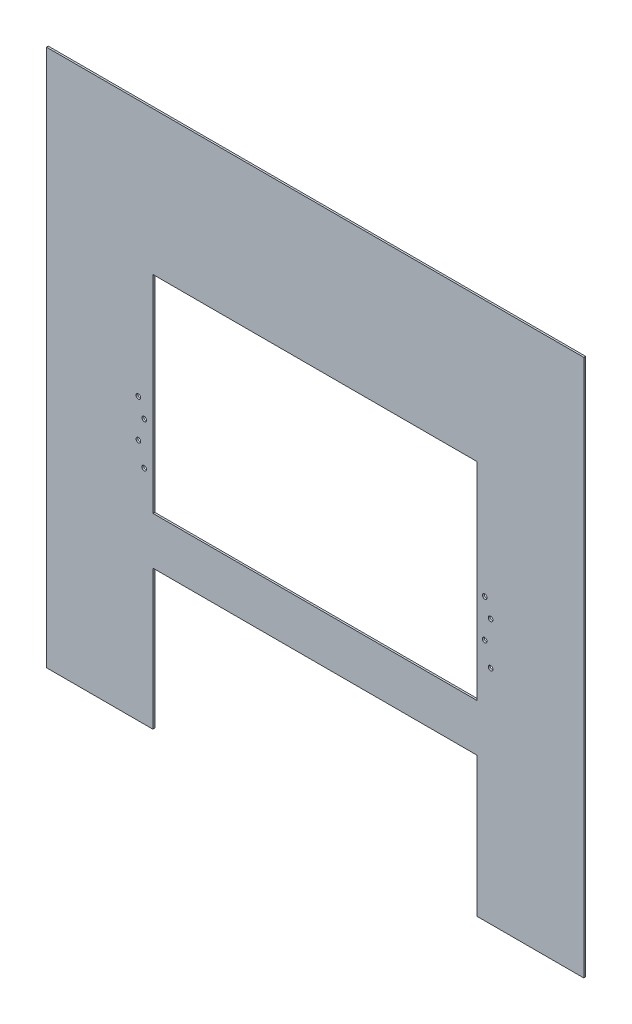
ISO-10303-21;
HEADER;
FILE_DESCRIPTION(('STEP AP214'),'2;1');
FILE_NAME('part.step','',(''),(''),'','','');
FILE_SCHEMA(('AUTOMOTIVE_DESIGN { 1 0 10303 214 1 1 1 1 }'));
ENDSEC;
DATA;
#1=APPLICATION_CONTEXT('core data for automotive mechanical design processes');
#2=APPLICATION_PROTOCOL_DEFINITION('international standard','automotive_design',2000,#1);
#3=PRODUCT_CONTEXT('',#1,'mechanical');
#4=PRODUCT('Part','Part','',(#3));
#5=PRODUCT_RELATED_PRODUCT_CATEGORY('part','',(#4));
#6=PRODUCT_DEFINITION_FORMATION('','',#4);
#7=PRODUCT_DEFINITION_CONTEXT('part definition',#1,'design');
#8=PRODUCT_DEFINITION('design','',#6,#7);
#9=PRODUCT_DEFINITION_SHAPE('','',#8);
#10=(LENGTH_UNIT() NAMED_UNIT(*) SI_UNIT(.MILLI.,.METRE.));
#11=(NAMED_UNIT(*) PLANE_ANGLE_UNIT() SI_UNIT($,.RADIAN.));
#12=(NAMED_UNIT(*) SI_UNIT($,.STERADIAN.) SOLID_ANGLE_UNIT());
#13=UNCERTAINTY_MEASURE_WITH_UNIT(LENGTH_MEASURE(1.E-05),#10,'distance_accuracy_value','');
#14=(GEOMETRIC_REPRESENTATION_CONTEXT(3) GLOBAL_UNCERTAINTY_ASSIGNED_CONTEXT((#13)) GLOBAL_UNIT_ASSIGNED_CONTEXT((#10,
#11,#12)) REPRESENTATION_CONTEXT('',''));
#15=CARTESIAN_POINT('',(0.,0.,0.));
#16=DIRECTION('',(0.,0.,1.));
#17=DIRECTION('',(1.,0.,0.));
#18=AXIS2_PLACEMENT_3D('',#15,#16,#17);
#19=CARTESIAN_POINT('',(0.,0.,2.));
#20=DIRECTION('',(0.,0.,-1.));
#21=DIRECTION('',(-1.,0.,0.));
#22=AXIS2_PLACEMENT_3D('',#19,#20,#21);
#23=PLANE('',#22);
#24=DIRECTION('',(0.,1.,0.));
#25=VECTOR('',#24,1.);
#26=CARTESIAN_POINT('',(650.,580.,2.));
#27=LINE('',#26,#25);
#28=CARTESIAN_POINT('',(650.,0.,2.));
#29=VERTEX_POINT('',#28);
#30=CARTESIAN_POINT('',(650.,580.,2.));
#31=VERTEX_POINT('',#30);
#32=EDGE_CURVE('E165',#29,#31,#27,.T.);
#33=ORIENTED_EDGE('',*,*,#32,.T.);
#34=DIRECTION('',(-1.,0.,0.));
#35=VECTOR('',#34,1.);
#36=CARTESIAN_POINT('',(69.9999999999999,580.,2.));
#37=LINE('',#36,#35);
#38=CARTESIAN_POINT('',(69.9999999999999,580.,2.));
#39=VERTEX_POINT('',#38);
#40=EDGE_CURVE('E168',#31,#39,#37,.T.);
#41=ORIENTED_EDGE('',*,*,#40,.T.);
#42=DIRECTION('',(0.,-1.,0.));
#43=VECTOR('',#42,1.);
#44=CARTESIAN_POINT('',(69.9999999999999,580.,2.));
#45=LINE('',#44,#43);
#46=CARTESIAN_POINT('',(69.9999999999999,0.,2.));
#47=VERTEX_POINT('',#46);
#48=EDGE_CURVE('E171',#39,#47,#45,.T.);
#49=ORIENTED_EDGE('',*,*,#48,.T.);
#50=DIRECTION('',(1.,0.,0.));
#51=VECTOR('',#50,1.);
#52=CARTESIAN_POINT('',(69.9999999999999,0.,2.));
#53=LINE('',#52,#51);
#54=CARTESIAN_POINT('',(185.,0.,2.));
#55=VERTEX_POINT('',#54);
#56=EDGE_CURVE('E173',#47,#55,#53,.T.);
#57=ORIENTED_EDGE('',*,*,#56,.T.);
#58=DIRECTION('',(0.,1.,0.));
#59=VECTOR('',#58,1.);
#60=CARTESIAN_POINT('',(185.,150.575,2.));
#61=LINE('',#60,#59);
#62=CARTESIAN_POINT('',(185.,150.575,2.));
#63=VERTEX_POINT('',#62);
#64=EDGE_CURVE('E175',#55,#63,#61,.T.);
#65=ORIENTED_EDGE('',*,*,#64,.T.);
#66=DIRECTION('',(1.,0.,0.));
#67=VECTOR('',#66,1.);
#68=CARTESIAN_POINT('',(185.,150.575,2.));
#69=LINE('',#68,#67);
#70=CARTESIAN_POINT('',(535.,150.575,2.));
#71=VERTEX_POINT('',#70);
#72=EDGE_CURVE('E177',#63,#71,#69,.T.);
#73=ORIENTED_EDGE('',*,*,#72,.T.);
#74=DIRECTION('',(0.,-1.,0.));
#75=VECTOR('',#74,1.);
#76=CARTESIAN_POINT('',(535.,150.575,2.));
#77=LINE('',#76,#75);
#78=CARTESIAN_POINT('',(535.,0.,2.));
#79=VERTEX_POINT('',#78);
#80=EDGE_CURVE('E179',#71,#79,#77,.T.);
#81=ORIENTED_EDGE('',*,*,#80,.T.);
#82=DIRECTION('',(1.,0.,0.));
#83=VECTOR('',#82,1.);
#84=CARTESIAN_POINT('',(650.,0.,2.));
#85=LINE('',#84,#83);
#86=EDGE_CURVE('E181',#79,#29,#85,.T.);
#87=ORIENTED_EDGE('',*,*,#86,.T.);
#88=EDGE_LOOP('',(#33,#41,#49,#57,#65,#73,#81,#87));
#89=FACE_BOUND('',#88,.T.);
#90=DIRECTION('',(0.,-1.,0.));
#91=VECTOR('',#90,1.);
#92=CARTESIAN_POINT('',(185.,425.,2.));
#93=LINE('',#92,#91);
#94=CARTESIAN_POINT('',(185.,425.,2.));
#95=VERTEX_POINT('',#94);
#96=CARTESIAN_POINT('',(185.,201.725,2.));
#97=VERTEX_POINT('',#96);
#98=EDGE_CURVE('E126',#95,#97,#93,.T.);
#99=ORIENTED_EDGE('',*,*,#98,.F.);
#100=DIRECTION('',(-1.,0.,0.));
#101=VECTOR('',#100,1.);
#102=CARTESIAN_POINT('',(185.,425.,2.));
#103=LINE('',#102,#101);
#104=CARTESIAN_POINT('',(535.,425.,2.));
#105=VERTEX_POINT('',#104);
#106=EDGE_CURVE('E149',#105,#95,#103,.T.);
#107=ORIENTED_EDGE('',*,*,#106,.F.);
#108=DIRECTION('',(0.,1.,0.));
#109=VECTOR('',#108,1.);
#110=CARTESIAN_POINT('',(535.,425.,2.));
#111=LINE('',#110,#109);
#112=CARTESIAN_POINT('',(535.,201.725,2.));
#113=VERTEX_POINT('',#112);
#114=EDGE_CURVE('E147',#113,#105,#111,.T.);
#115=ORIENTED_EDGE('',*,*,#114,.F.);
#116=DIRECTION('',(1.,0.,0.));
#117=VECTOR('',#116,1.);
#118=CARTESIAN_POINT('',(185.,201.725,2.));
#119=LINE('',#118,#117);
#120=EDGE_CURVE('E134',#97,#113,#119,.T.);
#121=ORIENTED_EDGE('',*,*,#120,.F.);
#122=EDGE_LOOP('',(#99,#107,#115,#121));
#123=FACE_BOUND('',#122,.T.);
#124=CARTESIAN_POINT('',(169.299999999994,303.1,2.));
#125=DIRECTION('',(0.,0.,1.));
#126=DIRECTION('',(1.,0.,0.));
#127=AXIS2_PLACEMENT_3D('',#124,#125,#126);
#128=CIRCLE('',#127,2.50000000000579);
#129=CARTESIAN_POINT('',(171.8,303.1,2.));
#130=VERTEX_POINT('',#129);
#131=EDGE_CURVE('E155',#130,#130,#128,.T.);
#132=ORIENTED_EDGE('',*,*,#131,.F.);
#133=EDGE_LOOP('',(#132));
#134=FACE_BOUND('',#133,.T.);
#135=CARTESIAN_POINT('',(175.620271067171,285.300000000006,2.));
#136=DIRECTION('',(0.,0.,1.));
#137=DIRECTION('',(1.,0.,0.));
#138=AXIS2_PLACEMENT_3D('',#135,#136,#137);
#139=CIRCLE('',#138,2.50000000000649);
#140=CARTESIAN_POINT('',(178.120271067178,285.300000000006,2.));
#141=VERTEX_POINT('',#140);
#142=EDGE_CURVE('E367',#141,#141,#139,.T.);
#143=ORIENTED_EDGE('',*,*,#142,.F.);
#144=EDGE_LOOP('',(#143));
#145=FACE_BOUND('',#144,.T.);
#146=CARTESIAN_POINT('',(175.620271067171,239.279728932807,2.));
#147=DIRECTION('',(0.,0.,1.));
#148=DIRECTION('',(1.,0.,0.));
#149=AXIS2_PLACEMENT_3D('',#146,#147,#148);
#150=CIRCLE('',#149,2.50000000000649);
#151=CARTESIAN_POINT('',(178.120271067178,239.279728932807,2.));
#152=VERTEX_POINT('',#151);
#153=EDGE_CURVE('E361',#152,#152,#150,.T.);
#154=ORIENTED_EDGE('',*,*,#153,.F.);
#155=EDGE_LOOP('',(#154));
#156=FACE_BOUND('',#155,.T.);
#157=CARTESIAN_POINT('',(169.3,262.3,2.));
#158=DIRECTION('',(0.,0.,1.));
#159=DIRECTION('',(1.,0.,0.));
#160=AXIS2_PLACEMENT_3D('',#157,#158,#159);
#161=CIRCLE('',#160,2.5);
#162=CARTESIAN_POINT('',(171.8,262.3,2.));
#163=VERTEX_POINT('',#162);
#164=EDGE_CURVE('E355',#163,#163,#161,.T.);
#165=ORIENTED_EDGE('',*,*,#164,.F.);
#166=EDGE_LOOP('',(#165));
#167=FACE_BOUND('',#166,.T.);
#168=CARTESIAN_POINT('',(543.099999999994,303.100000000007,2.));
#169=DIRECTION('',(0.,0.,1.));
#170=DIRECTION('',(1.,0.,0.));
#171=AXIS2_PLACEMENT_3D('',#168,#169,#170);
#172=CIRCLE('',#171,2.50000000000571);
#173=CARTESIAN_POINT('',(545.6,303.100000000007,2.));
#174=VERTEX_POINT('',#173);
#175=EDGE_CURVE('E349',#174,#174,#172,.T.);
#176=ORIENTED_EDGE('',*,*,#175,.F.);
#177=EDGE_LOOP('',(#176));
#178=FACE_BOUND('',#177,.T.);
#179=CARTESIAN_POINT('',(549.420271067171,285.300000000012,2.));
#180=DIRECTION('',(0.,0.,1.));
#181=DIRECTION('',(1.,0.,0.));
#182=AXIS2_PLACEMENT_3D('',#179,#180,#181);
#183=CIRCLE('',#182,2.50000000000652);
#184=CARTESIAN_POINT('',(551.920271067178,285.300000000012,2.));
#185=VERTEX_POINT('',#184);
#186=EDGE_CURVE('E343',#185,#185,#183,.T.);
#187=ORIENTED_EDGE('',*,*,#186,.F.);
#188=EDGE_LOOP('',(#187));
#189=FACE_BOUND('',#188,.T.);
#190=CARTESIAN_POINT('',(549.420271067171,239.279728932813,2.));
#191=DIRECTION('',(0.,0.,1.));
#192=DIRECTION('',(1.,0.,0.));
#193=AXIS2_PLACEMENT_3D('',#190,#191,#192);
#194=CIRCLE('',#193,2.50000000000651);
#195=CARTESIAN_POINT('',(551.920271067178,239.279728932813,2.));
#196=VERTEX_POINT('',#195);
#197=EDGE_CURVE('E337',#196,#196,#194,.T.);
#198=ORIENTED_EDGE('',*,*,#197,.F.);
#199=EDGE_LOOP('',(#198));
#200=FACE_BOUND('',#199,.T.);
#201=CARTESIAN_POINT('',(543.1,262.300000000007,2.));
#202=DIRECTION('',(0.,0.,1.));
#203=DIRECTION('',(1.,0.,0.));
#204=AXIS2_PLACEMENT_3D('',#201,#202,#203);
#205=CIRCLE('',#204,2.50000000000002);
#206=CARTESIAN_POINT('',(545.6,262.300000000007,2.));
#207=VERTEX_POINT('',#206);
#208=EDGE_CURVE('E328',#207,#207,#205,.T.);
#209=ORIENTED_EDGE('',*,*,#208,.F.);
#210=EDGE_LOOP('',(#209));
#211=FACE_BOUND('',#210,.T.);
#212=ADVANCED_FACE('F37',(#89,#123,#134,#145,#156,#167,#178,#189,#200,#211),#23,.F.);
#213=CARTESIAN_POINT('',(0.,0.,0.));
#214=DIRECTION('',(0.,0.,-1.));
#215=DIRECTION('',(-1.,0.,0.));
#216=AXIS2_PLACEMENT_3D('',#213,#214,#215);
#217=PLANE('',#216);
#218=CARTESIAN_POINT('',(549.420271067171,239.279728932813,0.));
#219=DIRECTION('',(0.,0.,1.));
#220=DIRECTION('',(1.,0.,0.));
#221=AXIS2_PLACEMENT_3D('',#218,#219,#220);
#222=CIRCLE('',#221,2.50000000000651);
#223=CARTESIAN_POINT('',(551.920271067178,239.279728932813,0.));
#224=VERTEX_POINT('',#223);
#225=EDGE_CURVE('E334',#224,#224,#222,.T.);
#226=ORIENTED_EDGE('',*,*,#225,.T.);
#227=EDGE_LOOP('',(#226));
#228=FACE_BOUND('',#227,.T.);
#229=CARTESIAN_POINT('',(543.099999999994,303.100000000007,0.));
#230=DIRECTION('',(0.,0.,1.));
#231=DIRECTION('',(1.,0.,0.));
#232=AXIS2_PLACEMENT_3D('',#229,#230,#231);
#233=CIRCLE('',#232,2.50000000000571);
#234=CARTESIAN_POINT('',(545.6,303.100000000007,0.));
#235=VERTEX_POINT('',#234);
#236=EDGE_CURVE('E346',#235,#235,#233,.T.);
#237=ORIENTED_EDGE('',*,*,#236,.T.);
#238=EDGE_LOOP('',(#237));
#239=FACE_BOUND('',#238,.T.);
#240=CARTESIAN_POINT('',(175.620271067171,239.279728932807,0.));
#241=DIRECTION('',(0.,0.,1.));
#242=DIRECTION('',(1.,0.,0.));
#243=AXIS2_PLACEMENT_3D('',#240,#241,#242);
#244=CIRCLE('',#243,2.50000000000649);
#245=CARTESIAN_POINT('',(178.120271067178,239.279728932807,0.));
#246=VERTEX_POINT('',#245);
#247=EDGE_CURVE('E358',#246,#246,#244,.T.);
#248=ORIENTED_EDGE('',*,*,#247,.T.);
#249=EDGE_LOOP('',(#248));
#250=FACE_BOUND('',#249,.T.);
#251=CARTESIAN_POINT('',(169.299999999994,303.1,0.));
#252=DIRECTION('',(0.,0.,1.));
#253=DIRECTION('',(1.,0.,0.));
#254=AXIS2_PLACEMENT_3D('',#251,#252,#253);
#255=CIRCLE('',#254,2.50000000000579);
#256=CARTESIAN_POINT('',(171.8,303.1,0.));
#257=VERTEX_POINT('',#256);
#258=EDGE_CURVE('E370',#257,#257,#255,.T.);
#259=ORIENTED_EDGE('',*,*,#258,.T.);
#260=EDGE_LOOP('',(#259));
#261=FACE_BOUND('',#260,.T.);
#262=DIRECTION('',(0.,1.,0.));
#263=VECTOR('',#262,1.);
#264=CARTESIAN_POINT('',(650.,580.,0.));
#265=LINE('',#264,#263);
#266=CARTESIAN_POINT('',(650.,0.,0.));
#267=VERTEX_POINT('',#266);
#268=CARTESIAN_POINT('',(650.,580.,0.));
#269=VERTEX_POINT('',#268);
#270=EDGE_CURVE('E142',#267,#269,#265,.T.);
#271=ORIENTED_EDGE('',*,*,#270,.F.);
#272=DIRECTION('',(1.,0.,0.));
#273=VECTOR('',#272,1.);
#274=CARTESIAN_POINT('',(650.,0.,0.));
#275=LINE('',#274,#273);
#276=CARTESIAN_POINT('',(535.,0.,0.));
#277=VERTEX_POINT('',#276);
#278=EDGE_CURVE('E169',#277,#267,#275,.T.);
#279=ORIENTED_EDGE('',*,*,#278,.F.);
#280=DIRECTION('',(0.,-1.,0.));
#281=VECTOR('',#280,1.);
#282=CARTESIAN_POINT('',(535.,150.575,0.));
#283=LINE('',#282,#281);
#284=CARTESIAN_POINT('',(535.,150.575,0.));
#285=VERTEX_POINT('',#284);
#286=EDGE_CURVE('E196',#285,#277,#283,.T.);
#287=ORIENTED_EDGE('',*,*,#286,.F.);
#288=DIRECTION('',(1.,0.,0.));
#289=VECTOR('',#288,1.);
#290=CARTESIAN_POINT('',(185.,150.575,0.));
#291=LINE('',#290,#289);
#292=CARTESIAN_POINT('',(185.,150.575,0.));
#293=VERTEX_POINT('',#292);
#294=EDGE_CURVE('E194',#293,#285,#291,.T.);
#295=ORIENTED_EDGE('',*,*,#294,.F.);
#296=DIRECTION('',(0.,1.,0.));
#297=VECTOR('',#296,1.);
#298=CARTESIAN_POINT('',(185.,150.575,0.));
#299=LINE('',#298,#297);
#300=CARTESIAN_POINT('',(185.,0.,0.));
#301=VERTEX_POINT('',#300);
#302=EDGE_CURVE('E192',#301,#293,#299,.T.);
#303=ORIENTED_EDGE('',*,*,#302,.F.);
#304=DIRECTION('',(1.,0.,0.));
#305=VECTOR('',#304,1.);
#306=CARTESIAN_POINT('',(69.9999999999999,0.,0.));
#307=LINE('',#306,#305);
#308=CARTESIAN_POINT('',(69.9999999999999,0.,0.));
#309=VERTEX_POINT('',#308);
#310=EDGE_CURVE('E190',#309,#301,#307,.T.);
#311=ORIENTED_EDGE('',*,*,#310,.F.);
#312=DIRECTION('',(0.,-1.,0.));
#313=VECTOR('',#312,1.);
#314=CARTESIAN_POINT('',(69.9999999999999,580.,0.));
#315=LINE('',#314,#313);
#316=CARTESIAN_POINT('',(69.9999999999999,580.,0.));
#317=VERTEX_POINT('',#316);
#318=EDGE_CURVE('E188',#317,#309,#315,.T.);
#319=ORIENTED_EDGE('',*,*,#318,.F.);
#320=DIRECTION('',(-1.,0.,0.));
#321=VECTOR('',#320,1.);
#322=CARTESIAN_POINT('',(69.9999999999999,580.,0.));
#323=LINE('',#322,#321);
#324=EDGE_CURVE('E186',#269,#317,#323,.T.);
#325=ORIENTED_EDGE('',*,*,#324,.F.);
#326=EDGE_LOOP('',(#271,#279,#287,#295,#303,#311,#319,#325));
#327=FACE_BOUND('',#326,.T.);
#328=DIRECTION('',(-1.,0.,0.));
#329=VECTOR('',#328,1.);
#330=CARTESIAN_POINT('',(185.,425.,0.));
#331=LINE('',#330,#329);
#332=CARTESIAN_POINT('',(535.,425.,0.));
#333=VERTEX_POINT('',#332);
#334=CARTESIAN_POINT('',(185.,425.,0.));
#335=VERTEX_POINT('',#334);
#336=EDGE_CURVE('E135',#333,#335,#331,.T.);
#337=ORIENTED_EDGE('',*,*,#336,.T.);
#338=DIRECTION('',(0.,-1.,0.));
#339=VECTOR('',#338,1.);
#340=CARTESIAN_POINT('',(185.,425.,0.));
#341=LINE('',#340,#339);
#342=CARTESIAN_POINT('',(185.,201.725,0.));
#343=VERTEX_POINT('',#342);
#344=EDGE_CURVE('E60',#335,#343,#341,.T.);
#345=ORIENTED_EDGE('',*,*,#344,.T.);
#346=DIRECTION('',(1.,0.,0.));
#347=VECTOR('',#346,1.);
#348=CARTESIAN_POINT('',(185.,201.725,0.));
#349=LINE('',#348,#347);
#350=CARTESIAN_POINT('',(535.,201.725,0.));
#351=VERTEX_POINT('',#350);
#352=EDGE_CURVE('E141',#343,#351,#349,.T.);
#353=ORIENTED_EDGE('',*,*,#352,.T.);
#354=DIRECTION('',(0.,1.,0.));
#355=VECTOR('',#354,1.);
#356=CARTESIAN_POINT('',(535.,425.,0.));
#357=LINE('',#356,#355);
#358=EDGE_CURVE('E157',#351,#333,#357,.T.);
#359=ORIENTED_EDGE('',*,*,#358,.T.);
#360=EDGE_LOOP('',(#337,#345,#353,#359));
#361=FACE_BOUND('',#360,.T.);
#362=CARTESIAN_POINT('',(175.620271067171,285.300000000006,0.));
#363=DIRECTION('',(0.,0.,1.));
#364=DIRECTION('',(1.,0.,0.));
#365=AXIS2_PLACEMENT_3D('',#362,#363,#364);
#366=CIRCLE('',#365,2.50000000000649);
#367=CARTESIAN_POINT('',(178.120271067178,285.300000000006,0.));
#368=VERTEX_POINT('',#367);
#369=EDGE_CURVE('E364',#368,#368,#366,.T.);
#370=ORIENTED_EDGE('',*,*,#369,.T.);
#371=EDGE_LOOP('',(#370));
#372=FACE_BOUND('',#371,.T.);
#373=CARTESIAN_POINT('',(169.3,262.3,0.));
#374=DIRECTION('',(0.,0.,1.));
#375=DIRECTION('',(1.,0.,0.));
#376=AXIS2_PLACEMENT_3D('',#373,#374,#375);
#377=CIRCLE('',#376,2.5);
#378=CARTESIAN_POINT('',(171.8,262.3,0.));
#379=VERTEX_POINT('',#378);
#380=EDGE_CURVE('E352',#379,#379,#377,.T.);
#381=ORIENTED_EDGE('',*,*,#380,.T.);
#382=EDGE_LOOP('',(#381));
#383=FACE_BOUND('',#382,.T.);
#384=CARTESIAN_POINT('',(549.420271067171,285.300000000012,0.));
#385=DIRECTION('',(0.,0.,1.));
#386=DIRECTION('',(1.,0.,0.));
#387=AXIS2_PLACEMENT_3D('',#384,#385,#386);
#388=CIRCLE('',#387,2.50000000000652);
#389=CARTESIAN_POINT('',(551.920271067178,285.300000000012,0.));
#390=VERTEX_POINT('',#389);
#391=EDGE_CURVE('E340',#390,#390,#388,.T.);
#392=ORIENTED_EDGE('',*,*,#391,.T.);
#393=EDGE_LOOP('',(#392));
#394=FACE_BOUND('',#393,.T.);
#395=CARTESIAN_POINT('',(543.1,262.300000000007,0.));
#396=DIRECTION('',(0.,0.,1.));
#397=DIRECTION('',(1.,0.,0.));
#398=AXIS2_PLACEMENT_3D('',#395,#396,#397);
#399=CIRCLE('',#398,2.50000000000002);
#400=CARTESIAN_POINT('',(545.6,262.300000000007,0.));
#401=VERTEX_POINT('',#400);
#402=EDGE_CURVE('E331',#401,#401,#399,.T.);
#403=ORIENTED_EDGE('',*,*,#402,.T.);
#404=EDGE_LOOP('',(#403));
#405=FACE_BOUND('',#404,.T.);
#406=ADVANCED_FACE('F226',(#228,#239,#250,#261,#327,#361,#372,#383,#394,#405),#217,.T.);
#407=CARTESIAN_POINT('',(650.,580.,2.));
#408=DIRECTION('',(-1.,0.,0.));
#409=DIRECTION('',(0.,0.,1.));
#410=AXIS2_PLACEMENT_3D('',#407,#408,#409);
#411=PLANE('',#410);
#412=ORIENTED_EDGE('',*,*,#270,.T.);
#413=DIRECTION('',(0.,0.,-1.));
#414=VECTOR('',#413,1.);
#415=CARTESIAN_POINT('',(650.,580.,2.));
#416=LINE('',#415,#414);
#417=EDGE_CURVE('E11',#31,#269,#416,.T.);
#418=ORIENTED_EDGE('',*,*,#417,.F.);
#419=ORIENTED_EDGE('',*,*,#32,.F.);
#420=DIRECTION('',(0.,0.,-1.));
#421=VECTOR('',#420,1.);
#422=CARTESIAN_POINT('',(650.,0.,2.));
#423=LINE('',#422,#421);
#424=EDGE_CURVE('E183',#29,#267,#423,.T.);
#425=ORIENTED_EDGE('',*,*,#424,.T.);
#426=EDGE_LOOP('',(#412,#418,#419,#425));
#427=FACE_BOUND('',#426,.T.);
#428=ADVANCED_FACE('F39',(#427),#411,.F.);
#429=CARTESIAN_POINT('',(69.9999999999999,580.,2.));
#430=DIRECTION('',(0.,-1.,0.));
#431=DIRECTION('',(0.,0.,-1.));
#432=AXIS2_PLACEMENT_3D('',#429,#430,#431);
#433=PLANE('',#432);
#434=ORIENTED_EDGE('',*,*,#324,.T.);
#435=DIRECTION('',(0.,0.,-1.));
#436=VECTOR('',#435,1.);
#437=CARTESIAN_POINT('',(69.9999999999999,580.,2.));
#438=LINE('',#437,#436);
#439=EDGE_CURVE('E45',#39,#317,#438,.T.);
#440=ORIENTED_EDGE('',*,*,#439,.F.);
#441=ORIENTED_EDGE('',*,*,#40,.F.);
#442=ORIENTED_EDGE('',*,*,#417,.T.);
#443=EDGE_LOOP('',(#434,#440,#441,#442));
#444=FACE_BOUND('',#443,.T.);
#445=ADVANCED_FACE('F243',(#444),#433,.F.);
#446=CARTESIAN_POINT('',(69.9999999999999,580.,2.));
#447=DIRECTION('',(1.,0.,0.));
#448=DIRECTION('',(0.,0.,-1.));
#449=AXIS2_PLACEMENT_3D('',#446,#447,#448);
#450=PLANE('',#449);
#451=ORIENTED_EDGE('',*,*,#318,.T.);
#452=DIRECTION('',(0.,0.,-1.));
#453=VECTOR('',#452,1.);
#454=CARTESIAN_POINT('',(69.9999999999999,0.,2.));
#455=LINE('',#454,#453);
#456=EDGE_CURVE('E213',#47,#309,#455,.T.);
#457=ORIENTED_EDGE('',*,*,#456,.F.);
#458=ORIENTED_EDGE('',*,*,#48,.F.);
#459=ORIENTED_EDGE('',*,*,#439,.T.);
#460=EDGE_LOOP('',(#451,#457,#458,#459));
#461=FACE_BOUND('',#460,.T.);
#462=ADVANCED_FACE('F220',(#461),#450,.F.);
#463=CARTESIAN_POINT('',(69.9999999999999,0.,2.));
#464=DIRECTION('',(0.,1.,0.));
#465=DIRECTION('',(-1.,0.,0.));
#466=AXIS2_PLACEMENT_3D('',#463,#464,#465);
#467=PLANE('',#466);
#468=ORIENTED_EDGE('',*,*,#310,.T.);
#469=DIRECTION('',(0.,0.,-1.));
#470=VECTOR('',#469,1.);
#471=CARTESIAN_POINT('',(185.,0.,2.));
#472=LINE('',#471,#470);
#473=EDGE_CURVE('E210',#55,#301,#472,.T.);
#474=ORIENTED_EDGE('',*,*,#473,.F.);
#475=ORIENTED_EDGE('',*,*,#56,.F.);
#476=ORIENTED_EDGE('',*,*,#456,.T.);
#477=EDGE_LOOP('',(#468,#474,#475,#476));
#478=FACE_BOUND('',#477,.T.);
#479=ADVANCED_FACE('F232',(#478),#467,.F.);
#480=CARTESIAN_POINT('',(185.,150.575,2.));
#481=DIRECTION('',(-1.,0.,0.));
#482=DIRECTION('',(0.,-1.,0.));
#483=AXIS2_PLACEMENT_3D('',#480,#481,#482);
#484=PLANE('',#483);
#485=ORIENTED_EDGE('',*,*,#302,.T.);
#486=DIRECTION('',(0.,0.,-1.));
#487=VECTOR('',#486,1.);
#488=CARTESIAN_POINT('',(185.,150.575,2.));
#489=LINE('',#488,#487);
#490=EDGE_CURVE('E207',#63,#293,#489,.T.);
#491=ORIENTED_EDGE('',*,*,#490,.F.);
#492=ORIENTED_EDGE('',*,*,#64,.F.);
#493=ORIENTED_EDGE('',*,*,#473,.T.);
#494=EDGE_LOOP('',(#485,#491,#492,#493));
#495=FACE_BOUND('',#494,.T.);
#496=ADVANCED_FACE('F236',(#495),#484,.F.);
#497=CARTESIAN_POINT('',(185.,150.575,2.));
#498=DIRECTION('',(0.,1.,0.));
#499=DIRECTION('',(0.,0.,1.));
#500=AXIS2_PLACEMENT_3D('',#497,#498,#499);
#501=PLANE('',#500);
#502=ORIENTED_EDGE('',*,*,#294,.T.);
#503=DIRECTION('',(0.,0.,-1.));
#504=VECTOR('',#503,1.);
#505=CARTESIAN_POINT('',(535.,150.575,2.));
#506=LINE('',#505,#504);
#507=EDGE_CURVE('E204',#71,#285,#506,.T.);
#508=ORIENTED_EDGE('',*,*,#507,.F.);
#509=ORIENTED_EDGE('',*,*,#72,.F.);
#510=ORIENTED_EDGE('',*,*,#490,.T.);
#511=EDGE_LOOP('',(#502,#508,#509,#510));
#512=FACE_BOUND('',#511,.T.);
#513=ADVANCED_FACE('F256',(#512),#501,.F.);
#514=CARTESIAN_POINT('',(535.,150.575,2.));
#515=DIRECTION('',(1.,0.,0.));
#516=DIRECTION('',(0.,0.,-1.));
#517=AXIS2_PLACEMENT_3D('',#514,#515,#516);
#518=PLANE('',#517);
#519=ORIENTED_EDGE('',*,*,#286,.T.);
#520=DIRECTION('',(0.,0.,-1.));
#521=VECTOR('',#520,1.);
#522=CARTESIAN_POINT('',(535.,0.,2.));
#523=LINE('',#522,#521);
#524=EDGE_CURVE('E201',#79,#277,#523,.T.);
#525=ORIENTED_EDGE('',*,*,#524,.F.);
#526=ORIENTED_EDGE('',*,*,#80,.F.);
#527=ORIENTED_EDGE('',*,*,#507,.T.);
#528=EDGE_LOOP('',(#519,#525,#526,#527));
#529=FACE_BOUND('',#528,.T.);
#530=ADVANCED_FACE('F254',(#529),#518,.F.);
#531=CARTESIAN_POINT('',(650.,0.,2.));
#532=DIRECTION('',(0.,1.,0.));
#533=DIRECTION('',(-1.,0.,0.));
#534=AXIS2_PLACEMENT_3D('',#531,#532,#533);
#535=PLANE('',#534);
#536=ORIENTED_EDGE('',*,*,#278,.T.);
#537=ORIENTED_EDGE('',*,*,#424,.F.);
#538=ORIENTED_EDGE('',*,*,#86,.F.);
#539=ORIENTED_EDGE('',*,*,#524,.T.);
#540=EDGE_LOOP('',(#536,#537,#538,#539));
#541=FACE_BOUND('',#540,.T.);
#542=ADVANCED_FACE('F249',(#541),#535,.F.);
#543=CARTESIAN_POINT('',(185.,425.,2.));
#544=DIRECTION('',(1.,0.,0.));
#545=DIRECTION('',(0.,1.,0.));
#546=AXIS2_PLACEMENT_3D('',#543,#544,#545);
#547=PLANE('',#546);
#548=ORIENTED_EDGE('',*,*,#344,.F.);
#549=DIRECTION('',(0.,0.,-1.));
#550=VECTOR('',#549,1.);
#551=CARTESIAN_POINT('',(185.,425.,2.));
#552=LINE('',#551,#550);
#553=EDGE_CURVE('E130',#95,#335,#552,.T.);
#554=ORIENTED_EDGE('',*,*,#553,.F.);
#555=ORIENTED_EDGE('',*,*,#98,.T.);
#556=DIRECTION('',(0.,0.,-1.));
#557=VECTOR('',#556,1.);
#558=CARTESIAN_POINT('',(185.,201.725,2.));
#559=LINE('',#558,#557);
#560=EDGE_CURVE('E129',#97,#343,#559,.T.);
#561=ORIENTED_EDGE('',*,*,#560,.T.);
#562=EDGE_LOOP('',(#548,#554,#555,#561));
#563=FACE_BOUND('',#562,.T.);
#564=ADVANCED_FACE('F128',(#563),#547,.T.);
#565=CARTESIAN_POINT('',(185.,201.725,2.));
#566=DIRECTION('',(0.,1.,0.));
#567=DIRECTION('',(0.,0.,1.));
#568=AXIS2_PLACEMENT_3D('',#565,#566,#567);
#569=PLANE('',#568);
#570=ORIENTED_EDGE('',*,*,#352,.F.);
#571=ORIENTED_EDGE('',*,*,#560,.F.);
#572=ORIENTED_EDGE('',*,*,#120,.T.);
#573=DIRECTION('',(0.,0.,-1.));
#574=VECTOR('',#573,1.);
#575=CARTESIAN_POINT('',(535.,201.725,2.));
#576=LINE('',#575,#574);
#577=EDGE_CURVE('E143',#113,#351,#576,.T.);
#578=ORIENTED_EDGE('',*,*,#577,.T.);
#579=EDGE_LOOP('',(#570,#571,#572,#578));
#580=FACE_BOUND('',#579,.T.);
#581=ADVANCED_FACE('F138',(#580),#569,.T.);
#582=CARTESIAN_POINT('',(535.,425.,2.));
#583=DIRECTION('',(-1.,0.,0.));
#584=DIRECTION('',(0.,-1.,0.));
#585=AXIS2_PLACEMENT_3D('',#582,#583,#584);
#586=PLANE('',#585);
#587=ORIENTED_EDGE('',*,*,#358,.F.);
#588=ORIENTED_EDGE('',*,*,#577,.F.);
#589=ORIENTED_EDGE('',*,*,#114,.T.);
#590=DIRECTION('',(0.,0.,-1.));
#591=VECTOR('',#590,1.);
#592=CARTESIAN_POINT('',(535.,425.,2.));
#593=LINE('',#592,#591);
#594=EDGE_CURVE('E52',#105,#333,#593,.T.);
#595=ORIENTED_EDGE('',*,*,#594,.T.);
#596=EDGE_LOOP('',(#587,#588,#589,#595));
#597=FACE_BOUND('',#596,.T.);
#598=ADVANCED_FACE('F282',(#597),#586,.T.);
#599=CARTESIAN_POINT('',(185.,425.,2.));
#600=DIRECTION('',(0.,-1.,0.));
#601=DIRECTION('',(0.,0.,-1.));
#602=AXIS2_PLACEMENT_3D('',#599,#600,#601);
#603=PLANE('',#602);
#604=ORIENTED_EDGE('',*,*,#336,.F.);
#605=ORIENTED_EDGE('',*,*,#594,.F.);
#606=ORIENTED_EDGE('',*,*,#106,.T.);
#607=ORIENTED_EDGE('',*,*,#553,.T.);
#608=EDGE_LOOP('',(#604,#605,#606,#607));
#609=FACE_BOUND('',#608,.T.);
#610=ADVANCED_FACE('F286',(#609),#603,.T.);
#611=CARTESIAN_POINT('',(169.299999999994,303.1,2.));
#612=DIRECTION('',(0.,0.,-1.));
#613=DIRECTION('',(-1.,0.,0.));
#614=AXIS2_PLACEMENT_3D('',#611,#612,#613);
#615=CYLINDRICAL_SURFACE('',#614,2.50000000000579);
#616=ORIENTED_EDGE('',*,*,#131,.T.);
#617=EDGE_LOOP('',(#616));
#618=FACE_BOUND('',#617,.T.);
#619=ORIENTED_EDGE('',*,*,#258,.F.);
#620=EDGE_LOOP('',(#619));
#621=FACE_BOUND('',#620,.T.);
#622=ADVANCED_FACE('F292',(#618,#621),#615,.F.);
#623=CARTESIAN_POINT('',(175.620271067171,285.300000000006,2.));
#624=DIRECTION('',(0.,0.,-1.));
#625=DIRECTION('',(-1.,0.,0.));
#626=AXIS2_PLACEMENT_3D('',#623,#624,#625);
#627=CYLINDRICAL_SURFACE('',#626,2.50000000000649);
#628=ORIENTED_EDGE('',*,*,#142,.T.);
#629=EDGE_LOOP('',(#628));
#630=FACE_BOUND('',#629,.T.);
#631=ORIENTED_EDGE('',*,*,#369,.F.);
#632=EDGE_LOOP('',(#631));
#633=FACE_BOUND('',#632,.T.);
#634=ADVANCED_FACE('F295',(#630,#633),#627,.F.);
#635=CARTESIAN_POINT('',(175.620271067171,239.279728932807,2.));
#636=DIRECTION('',(0.,0.,-1.));
#637=DIRECTION('',(-1.,0.,0.));
#638=AXIS2_PLACEMENT_3D('',#635,#636,#637);
#639=CYLINDRICAL_SURFACE('',#638,2.50000000000649);
#640=ORIENTED_EDGE('',*,*,#153,.T.);
#641=EDGE_LOOP('',(#640));
#642=FACE_BOUND('',#641,.T.);
#643=ORIENTED_EDGE('',*,*,#247,.F.);
#644=EDGE_LOOP('',(#643));
#645=FACE_BOUND('',#644,.T.);
#646=ADVANCED_FACE('F299',(#642,#645),#639,.F.);
#647=CARTESIAN_POINT('',(169.3,262.3,2.));
#648=DIRECTION('',(0.,0.,-1.));
#649=DIRECTION('',(-1.,0.,0.));
#650=AXIS2_PLACEMENT_3D('',#647,#648,#649);
#651=CYLINDRICAL_SURFACE('',#650,2.5);
#652=ORIENTED_EDGE('',*,*,#164,.T.);
#653=EDGE_LOOP('',(#652));
#654=FACE_BOUND('',#653,.T.);
#655=ORIENTED_EDGE('',*,*,#380,.F.);
#656=EDGE_LOOP('',(#655));
#657=FACE_BOUND('',#656,.T.);
#658=ADVANCED_FACE('F303',(#654,#657),#651,.F.);
#659=CARTESIAN_POINT('',(543.099999999994,303.100000000007,2.));
#660=DIRECTION('',(0.,0.,-1.));
#661=DIRECTION('',(-1.,0.,0.));
#662=AXIS2_PLACEMENT_3D('',#659,#660,#661);
#663=CYLINDRICAL_SURFACE('',#662,2.50000000000571);
#664=ORIENTED_EDGE('',*,*,#175,.T.);
#665=EDGE_LOOP('',(#664));
#666=FACE_BOUND('',#665,.T.);
#667=ORIENTED_EDGE('',*,*,#236,.F.);
#668=EDGE_LOOP('',(#667));
#669=FACE_BOUND('',#668,.T.);
#670=ADVANCED_FACE('F307',(#666,#669),#663,.F.);
#671=CARTESIAN_POINT('',(549.420271067171,285.300000000012,2.));
#672=DIRECTION('',(0.,0.,-1.));
#673=DIRECTION('',(-1.,0.,0.));
#674=AXIS2_PLACEMENT_3D('',#671,#672,#673);
#675=CYLINDRICAL_SURFACE('',#674,2.50000000000652);
#676=ORIENTED_EDGE('',*,*,#186,.T.);
#677=EDGE_LOOP('',(#676));
#678=FACE_BOUND('',#677,.T.);
#679=ORIENTED_EDGE('',*,*,#391,.F.);
#680=EDGE_LOOP('',(#679));
#681=FACE_BOUND('',#680,.T.);
#682=ADVANCED_FACE('F311',(#678,#681),#675,.F.);
#683=CARTESIAN_POINT('',(549.420271067171,239.279728932813,2.));
#684=DIRECTION('',(0.,0.,-1.));
#685=DIRECTION('',(-1.,0.,0.));
#686=AXIS2_PLACEMENT_3D('',#683,#684,#685);
#687=CYLINDRICAL_SURFACE('',#686,2.50000000000651);
#688=ORIENTED_EDGE('',*,*,#197,.T.);
#689=EDGE_LOOP('',(#688));
#690=FACE_BOUND('',#689,.T.);
#691=ORIENTED_EDGE('',*,*,#225,.F.);
#692=EDGE_LOOP('',(#691));
#693=FACE_BOUND('',#692,.T.);
#694=ADVANCED_FACE('F315',(#690,#693),#687,.F.);
#695=CARTESIAN_POINT('',(543.1,262.300000000007,2.));
#696=DIRECTION('',(0.,0.,-1.));
#697=DIRECTION('',(-1.,0.,0.));
#698=AXIS2_PLACEMENT_3D('',#695,#696,#697);
#699=CYLINDRICAL_SURFACE('',#698,2.50000000000002);
#700=ORIENTED_EDGE('',*,*,#208,.T.);
#701=EDGE_LOOP('',(#700));
#702=FACE_BOUND('',#701,.T.);
#703=ORIENTED_EDGE('',*,*,#402,.F.);
#704=EDGE_LOOP('',(#703));
#705=FACE_BOUND('',#704,.T.);
#706=ADVANCED_FACE('F319',(#702,#705),#699,.F.);
#707=CLOSED_SHELL('',(#212,#406,#428,#445,#462,#479,#496,#513,#530,#542,#564,#581,#598,#610,
#622,#634,#646,#658,#670,#682,#694,#706));
#708=MANIFOLD_SOLID_BREP('B2',#707);
#709=ADVANCED_BREP_SHAPE_REPRESENTATION('',(#18,#708),#14);
#710=SHAPE_DEFINITION_REPRESENTATION(#9,#709);
ENDSEC;
END-ISO-10303-21;
